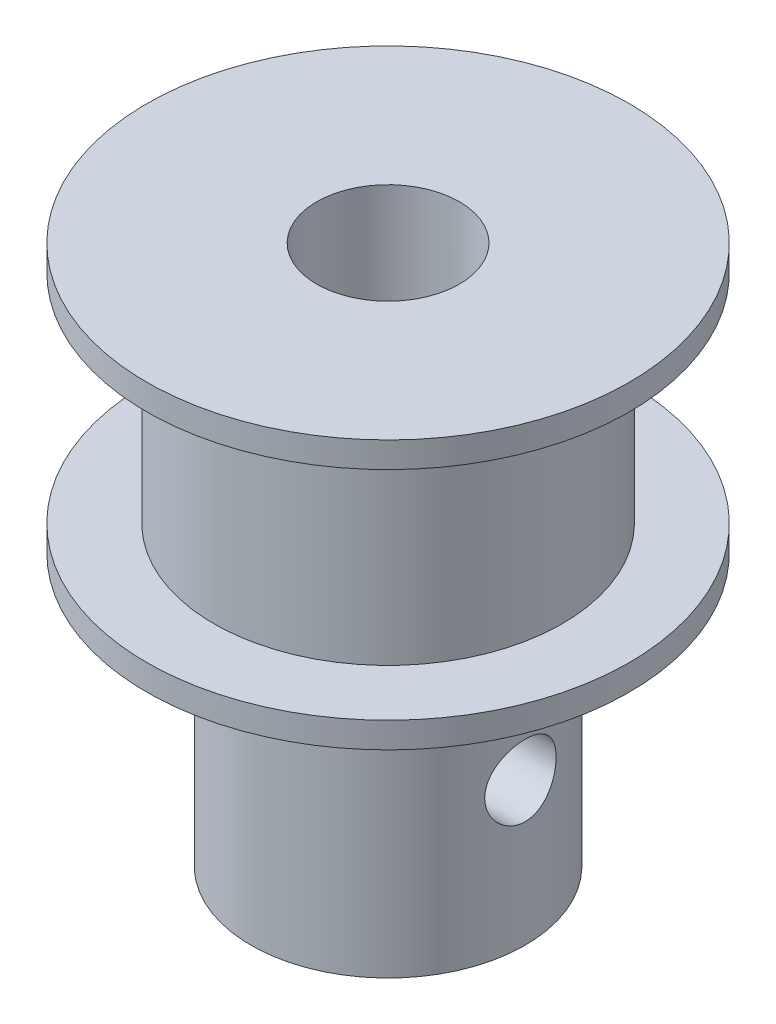
ISO-10303-21;
HEADER;
FILE_DESCRIPTION(('STEP AP214'),'2;1');
FILE_NAME('part.step','',(''),(''),'','','');
FILE_SCHEMA(('AUTOMOTIVE_DESIGN { 1 0 10303 214 1 1 1 1 }'));
ENDSEC;
DATA;
#1=APPLICATION_CONTEXT('core data for automotive mechanical design processes');
#2=APPLICATION_PROTOCOL_DEFINITION('international standard','automotive_design',2000,#1);
#3=PRODUCT_CONTEXT('',#1,'mechanical');
#4=PRODUCT('Part','Part','',(#3));
#5=PRODUCT_RELATED_PRODUCT_CATEGORY('part','',(#4));
#6=PRODUCT_DEFINITION_FORMATION('','',#4);
#7=PRODUCT_DEFINITION_CONTEXT('part definition',#1,'design');
#8=PRODUCT_DEFINITION('design','',#6,#7);
#9=PRODUCT_DEFINITION_SHAPE('','',#8);
#10=(LENGTH_UNIT() NAMED_UNIT(*) SI_UNIT(.MILLI.,.METRE.));
#11=(NAMED_UNIT(*) PLANE_ANGLE_UNIT() SI_UNIT($,.RADIAN.));
#12=(NAMED_UNIT(*) SI_UNIT($,.STERADIAN.) SOLID_ANGLE_UNIT());
#13=UNCERTAINTY_MEASURE_WITH_UNIT(LENGTH_MEASURE(1.E-05),#10,'distance_accuracy_value','');
#14=(GEOMETRIC_REPRESENTATION_CONTEXT(3) GLOBAL_UNCERTAINTY_ASSIGNED_CONTEXT((#13)) GLOBAL_UNIT_ASSIGNED_CONTEXT((#10,
#11,#12)) REPRESENTATION_CONTEXT('',''));
#15=CARTESIAN_POINT('',(0.,0.,0.));
#16=DIRECTION('',(0.,0.,1.));
#17=DIRECTION('',(1.,0.,0.));
#18=AXIS2_PLACEMENT_3D('',#15,#16,#17);
#19=CARTESIAN_POINT('',(0.,0.,0.));
#20=DIRECTION('',(0.,-1.,0.));
#21=DIRECTION('',(0.,0.,-1.));
#22=AXIS2_PLACEMENT_3D('',#19,#20,#21);
#23=CYLINDRICAL_SURFACE('',#22,2.5);
#24=CARTESIAN_POINT('',(2.16506350946109,5.,1.25000000000001));
#25=CARTESIAN_POINT('',(2.16506918410573,4.93486523975594,1.24999545384317));
#26=CARTESIAN_POINT('',(2.16804751484695,4.86964823559369,1.24487496341653));
#27=CARTESIAN_POINT('',(2.17952958065065,4.74121591915356,1.22465401237257));
#28=CARTESIAN_POINT('',(2.18804492569449,4.67800510619574,1.20953258069273));
#29=CARTESIAN_POINT('',(2.20936683256748,4.55568541957007,1.17012493587477));
#30=CARTESIAN_POINT('',(2.22215054341565,4.49655668440802,1.14588744061717));
#31=CARTESIAN_POINT('',(2.25053331021072,4.3832197475041,1.08908440672047));
#32=CARTESIAN_POINT('',(2.2661325184508,4.32901181217193,1.05651841754472));
#33=CARTESIAN_POINT('',(2.29996086321801,4.22211783930312,0.980833175663607));
#34=CARTESIAN_POINT('',(2.31830079547442,4.16992608040807,0.937065045179722));
#35=CARTESIAN_POINT('',(2.35464978482132,4.07323951449161,0.841567259518094));
#36=CARTESIAN_POINT('',(2.37265867289062,4.0287485467706,0.789833657227875));
#37=CARTESIAN_POINT('',(2.40776846191186,3.94579106106542,0.675611954268192));
#38=CARTESIAN_POINT('',(2.42472633022715,3.90793279017559,0.612633986265728));
#39=CARTESIAN_POINT('',(2.45438445124411,3.8435739334428,0.480196283249389));
#40=CARTESIAN_POINT('',(2.46708738979677,3.81706617982854,0.410740672672703));
#41=CARTESIAN_POINT('',(2.48600576555297,3.77811917337363,0.27255617990748));
#42=CARTESIAN_POINT('',(2.49261850276115,3.76481309205558,0.204127238111031));
#43=CARTESIAN_POINT('',(2.50009479807584,3.7497923516562,0.0657132858723191));
#44=CARTESIAN_POINT('',(2.50096183480737,3.74807067900536,-0.00427075730466423));
#45=CARTESIAN_POINT('',(2.49703727395563,3.75593334246294,-0.137290655529679));
#46=CARTESIAN_POINT('',(2.49273119865201,3.76454751940153,-0.20040149897098));
#47=CARTESIAN_POINT('',(2.47967806574684,3.79110105488082,-0.324142214897894));
#48=CARTESIAN_POINT('',(2.47093067582992,3.80904111122028,-0.384771901367398));
#49=CARTESIAN_POINT('',(2.44964479109568,3.85385320761227,-0.502886739461933));
#50=CARTESIAN_POINT('',(2.43705551911499,3.88084539146508,-0.560316779393964));
#51=CARTESIAN_POINT('',(2.40922057483359,3.94282927025187,-0.669971001891652));
#52=CARTESIAN_POINT('',(2.39397395196855,3.97782382912794,-0.722193311048298));
#53=CARTESIAN_POINT('',(2.36055492999037,4.05861918941627,-0.825217076122735));
#54=CARTESIAN_POINT('',(2.34224219997719,4.10512878540751,-0.875417593786692));
#55=CARTESIAN_POINT('',(2.30567925733515,4.20573715616272,-0.967630462872217));
#56=CARTESIAN_POINT('',(2.28742910332036,4.25984171534258,-1.00963651446778));
#57=CARTESIAN_POINT('',(2.25180195115606,4.37831024053011,-1.08688166830276));
#58=CARTESIAN_POINT('',(2.23455399988385,4.44310752881776,-1.12152164372256));
#59=CARTESIAN_POINT('',(2.2046931284822,4.57867208919875,-1.17914889125153));
#60=CARTESIAN_POINT('',(2.19207537557585,4.64943304127195,-1.2021483227636));
#61=CARTESIAN_POINT('',(2.17430794771293,4.78901813910349,-1.23397526378129));
#62=CARTESIAN_POINT('',(2.16864569810621,4.85755139880444,-1.24378140264996));
#63=CARTESIAN_POINT('',(2.16397399202012,4.99550167689568,-1.25189618326428));
#64=CARTESIAN_POINT('',(2.1649598361164,5.06491803639973,-1.25021294664377));
#65=CARTESIAN_POINT('',(2.17292920675731,5.19456739822341,-1.23629505417995));
#66=CARTESIAN_POINT('',(2.17924484383318,5.25497431388491,-1.22523477089058));
#67=CARTESIAN_POINT('',(2.19617526939177,5.3729597328387,-1.19462035579054));
#68=CARTESIAN_POINT('',(2.20679145006293,5.43053731343326,-1.17506347327951));
#69=CARTESIAN_POINT('',(2.23170277599571,5.54426416362837,-1.1270594857561));
#70=CARTESIAN_POINT('',(2.24614554053829,5.60022377106694,-1.0982425796159));
#71=CARTESIAN_POINT('',(2.27695149371562,5.70683658942374,-1.03285883001975));
#72=CARTESIAN_POINT('',(2.29331566693935,5.7574870543916,-0.996288005415263));
#73=CARTESIAN_POINT('',(2.3285999807042,5.85872345940444,-0.911046458998559));
#74=CARTESIAN_POINT('',(2.34758228942862,5.90849643839707,-0.8614315903937));
#75=CARTESIAN_POINT('',(2.38417793722366,5.99926529749199,-0.754255619247853));
#76=CARTESIAN_POINT('',(2.40179081259637,6.04025821278818,-0.696691843319175));
#77=CARTESIAN_POINT('',(2.43426702113696,6.11321715743763,-0.573169203198438));
#78=CARTESIAN_POINT('',(2.44904552090037,6.14491639776364,-0.507028871967633));
#79=CARTESIAN_POINT('',(2.47354193699126,6.19642237982174,-0.369402955801344));
#80=CARTESIAN_POINT('',(2.48326429595466,6.21623956420788,-0.297922126740211));
#81=CARTESIAN_POINT('',(2.49584385227353,6.24171070521833,-0.158724602913013));
#82=CARTESIAN_POINT('',(2.49924909885239,6.24849734484514,-0.0912643048130625));
#83=CARTESIAN_POINT('',(2.50052662968914,6.251054081818,0.0439074824390132));
#84=CARTESIAN_POINT('',(2.49840085083612,6.24682803565446,0.111618875368867));
#85=CARTESIAN_POINT('',(2.48917461047403,6.22822949150547,0.240672490396443));
#86=CARTESIAN_POINT('',(2.48241118334987,6.21454393842791,0.302140397264089));
#87=CARTESIAN_POINT('',(2.46490117079279,6.17834125087129,0.421807440229531));
#88=CARTESIAN_POINT('',(2.45415401415994,6.15582284988318,0.480006106194395));
#89=CARTESIAN_POINT('',(2.4290741343515,6.10159118479253,0.594279257806114));
#90=CARTESIAN_POINT('',(2.41460771498499,6.0695258459902,0.650156428375066));
#91=CARTESIAN_POINT('',(2.38360166427282,5.99755258642619,0.755968302267539));
#92=CARTESIAN_POINT('',(2.3670610819795,5.95764106360541,0.805900259268642));
#93=CARTESIAN_POINT('',(2.33160762783284,5.86650357622162,0.903642505196122));
#94=CARTESIAN_POINT('',(2.31262248764622,5.81454689065351,0.950747105674098));
#95=CARTESIAN_POINT('',(2.27578845203565,5.70318659858779,1.03582910924335));
#96=CARTESIAN_POINT('',(2.25794057202331,5.64377647391539,1.07379843751258));
#97=CARTESIAN_POINT('',(2.22499506631145,5.51670419177381,1.14053884973208));
#98=CARTESIAN_POINT('',(2.21000217820337,5.44884058608908,1.16898133245118));
#99=CARTESIAN_POINT('',(2.18582695410439,5.30833449457528,1.21359838688302));
#100=CARTESIAN_POINT('',(2.17662520184627,5.23570888885914,1.22981398896919));
#101=CARTESIAN_POINT('',(2.16911590752238,5.135243305435,1.24295875983053));
#102=CARTESIAN_POINT('',(2.16760161256439,5.10829013200265,1.24559513120482));
#103=CARTESIAN_POINT('',(2.16557419859687,5.0542293991472,1.24911675636246));
#104=CARTESIAN_POINT('',(2.16506114656386,5.02712182951766,1.25000189299985));
#105=CARTESIAN_POINT('',(2.16506350946109,5.,1.25000000000001));
#106=B_SPLINE_CURVE_WITH_KNOTS('',3,(#24,#25,#26,#27,#28,#29,#30,#31,#32,#33,#34,#35,#36,#37,
#38,#39,#40,#41,#42,#43,#44,#45,#46,#47,#48,#49,#50,#51,#52,#53,#54,#55,#56,#57,#58,#59,#60,#61,
#62,#63,#64,#65,#66,#67,#68,#69,#70,#71,#72,#73,#74,#75,#76,#77,#78,#79,#80,#81,#82,#83,#84,#85,
#86,#87,#88,#89,#90,#91,#92,#93,#94,#95,#96,#97,#98,#99,#100,#101,#102,#103,#104,#105),
.UNSPECIFIED.,.T.,.F.,(4,2,2,2,2,2,2,2,2,2,2,2,2,2,2,2,2,2,2,2,2,2,2,2,2,2,2,2,2,2,2,2,2,2,2,2,
2,2,2,2,4),(0.,0.195290153243395,0.390991116031006,0.585660744898608,0.780340906806437,
0.991077890622792,1.20191963855464,1.42697365298454,1.65188533704864,1.86079356209919,
2.0695752960755,2.26020121855673,2.45084140646819,2.64411918413933,2.8374662418784,
3.04908989321113,3.26087560307398,3.48611052161811,3.71110967764631,3.91827863567765,
4.12530116485466,4.30967729280032,4.49411315545079,4.6870912050761,4.88016857775059,
5.09758429475767,5.31507331222753,5.53830226766207,5.76133474760965,5.96390337986859,
6.16640108492465,6.35555531089366,6.54473666890016,6.7420093839934,6.93937287625899,
7.15637802312585,7.37357428556443,7.59763436298257,7.82093916253451,7.90225168981637,
7.98356965618176),.UNSPECIFIED.);
#107=CARTESIAN_POINT('',(2.16506350946109,5.,1.25000000000001));
#108=VERTEX_POINT('',#107);
#109=EDGE_CURVE('E103',#108,#108,#106,.T.);
#110=ORIENTED_EDGE('',*,*,#109,.T.);
#111=EDGE_LOOP('',(#110));
#112=FACE_BOUND('',#111,.T.);
#113=CARTESIAN_POINT('',(1.25,5.,-2.1650635094611));
#114=CARTESIAN_POINT('',(1.24999545384316,4.93486523975594,-2.16506918410574));
#115=CARTESIAN_POINT('',(1.24487496341652,4.86964823559369,-2.16804751484696));
#116=CARTESIAN_POINT('',(1.22465401237257,4.74121591915356,-2.17952958065065));
#117=CARTESIAN_POINT('',(1.20953258069272,4.67800510619574,-2.18804492569449));
#118=CARTESIAN_POINT('',(1.17012493587477,4.55568541957007,-2.20936683256748));
#119=CARTESIAN_POINT('',(1.14588744061716,4.49655668440802,-2.22215054341565));
#120=CARTESIAN_POINT('',(1.08908440672047,4.3832197475041,-2.25053331021072));
#121=CARTESIAN_POINT('',(1.05651841754472,4.32901181217193,-2.26613251845081));
#122=CARTESIAN_POINT('',(0.980833175663598,4.22211783930312,-2.29996086321802));
#123=CARTESIAN_POINT('',(0.937065045179713,4.16992608040807,-2.31830079547442));
#124=CARTESIAN_POINT('',(0.841567259518085,4.07323951449161,-2.35464978482132));
#125=CARTESIAN_POINT('',(0.789833657227866,4.0287485467706,-2.37265867289062));
#126=CARTESIAN_POINT('',(0.675611954268182,3.94579106106542,-2.40776846191186));
#127=CARTESIAN_POINT('',(0.612633986265718,3.90793279017559,-2.42472633022716));
#128=CARTESIAN_POINT('',(0.48019628324938,3.8435739334428,-2.45438445124411));
#129=CARTESIAN_POINT('',(0.410740672672694,3.81706617982854,-2.46708738979677));
#130=CARTESIAN_POINT('',(0.272556179907472,3.77811917337363,-2.48600576555297));
#131=CARTESIAN_POINT('',(0.204127238111022,3.76481309205558,-2.49261850276115));
#132=CARTESIAN_POINT('',(0.0657132858723103,3.7497923516562,-2.50009479807584));
#133=CARTESIAN_POINT('',(-0.00427075730467304,3.74807067900536,-2.50096183480737));
#134=CARTESIAN_POINT('',(-0.137290655529687,3.75593334246294,-2.49703727395563));
#135=CARTESIAN_POINT('',(-0.200401498970989,3.76454751940153,-2.492731198652));
#136=CARTESIAN_POINT('',(-0.324142214897902,3.79110105488082,-2.47967806574684));
#137=CARTESIAN_POINT('',(-0.384771901367407,3.80904111122028,-2.47093067582992));
#138=CARTESIAN_POINT('',(-0.502886739461942,3.85385320761227,-2.44964479109568));
#139=CARTESIAN_POINT('',(-0.560316779393973,3.88084539146508,-2.43705551911499));
#140=CARTESIAN_POINT('',(-0.669971001891661,3.94282927025187,-2.40922057483359));
#141=CARTESIAN_POINT('',(-0.722193311048307,3.97782382912794,-2.39397395196855));
#142=CARTESIAN_POINT('',(-0.825217076122744,4.05861918941627,-2.36055492999036));
#143=CARTESIAN_POINT('',(-0.875417593786701,4.10512878540751,-2.34224219997719));
#144=CARTESIAN_POINT('',(-0.967630462872225,4.20573715616272,-2.30567925733515));
#145=CARTESIAN_POINT('',(-1.00963651446779,4.25984171534258,-2.28742910332036));
#146=CARTESIAN_POINT('',(-1.08688166830276,4.37831024053011,-2.25180195115606));
#147=CARTESIAN_POINT('',(-1.12152164372256,4.44310752881776,-2.23455399988384));
#148=CARTESIAN_POINT('',(-1.17914889125154,4.57867208919875,-2.2046931284822));
#149=CARTESIAN_POINT('',(-1.20214832276361,4.64943304127195,-2.19207537557584));
#150=CARTESIAN_POINT('',(-1.2339752637813,4.78901813910349,-2.17430794771293));
#151=CARTESIAN_POINT('',(-1.24378140264997,4.85755139880444,-2.1686456981062));
#152=CARTESIAN_POINT('',(-1.25189618326428,4.99550167689568,-2.16397399202012));
#153=CARTESIAN_POINT('',(-1.25021294664378,5.06491803639973,-2.16495983611639));
#154=CARTESIAN_POINT('',(-1.23629505417996,5.19456739822341,-2.17292920675731));
#155=CARTESIAN_POINT('',(-1.22523477089058,5.25497431388491,-2.17924484383318));
#156=CARTESIAN_POINT('',(-1.19462035579055,5.3729597328387,-2.19617526939176));
#157=CARTESIAN_POINT('',(-1.17506347327952,5.43053731343326,-2.20679145006292));
#158=CARTESIAN_POINT('',(-1.12705948575611,5.54426416362837,-2.23170277599571));
#159=CARTESIAN_POINT('',(-1.0982425796159,5.60022377106694,-2.24614554053829));
#160=CARTESIAN_POINT('',(-1.03285883001976,5.70683658942374,-2.27695149371562));
#161=CARTESIAN_POINT('',(-0.996288005415271,5.7574870543916,-2.29331566693934));
#162=CARTESIAN_POINT('',(-0.911046458998567,5.85872345940444,-2.3285999807042));
#163=CARTESIAN_POINT('',(-0.861431590393709,5.90849643839707,-2.34758228942861));
#164=CARTESIAN_POINT('',(-0.754255619247861,5.99926529749199,-2.38417793722366));
#165=CARTESIAN_POINT('',(-0.696691843319184,6.04025821278818,-2.40179081259637));
#166=CARTESIAN_POINT('',(-0.573169203198446,6.11321715743763,-2.43426702113696));
#167=CARTESIAN_POINT('',(-0.507028871967641,6.14491639776364,-2.44904552090037));
#168=CARTESIAN_POINT('',(-0.369402955801352,6.19642237982174,-2.47354193699126));
#169=CARTESIAN_POINT('',(-0.29792212674022,6.21623956420788,-2.48326429595466));
#170=CARTESIAN_POINT('',(-0.158724602913021,6.24171070521833,-2.49584385227353));
#171=CARTESIAN_POINT('',(-0.0912643048130714,6.24849734484514,-2.49924909885239));
#172=CARTESIAN_POINT('',(0.0439074824390044,6.251054081818,-2.50052662968914));
#173=CARTESIAN_POINT('',(0.111618875368858,6.24682803565446,-2.49840085083612));
#174=CARTESIAN_POINT('',(0.240672490396434,6.22822949150547,-2.48917461047403));
#175=CARTESIAN_POINT('',(0.30214039726408,6.21454393842791,-2.48241118334987));
#176=CARTESIAN_POINT('',(0.421807440229522,6.17834125087129,-2.46490117079279));
#177=CARTESIAN_POINT('',(0.480006106194386,6.15582284988318,-2.45415401415995));
#178=CARTESIAN_POINT('',(0.594279257806106,6.10159118479253,-2.4290741343515));
#179=CARTESIAN_POINT('',(0.650156428375059,6.0695258459902,-2.41460771498499));
#180=CARTESIAN_POINT('',(0.755968302267532,5.99755258642619,-2.38360166427283));
#181=CARTESIAN_POINT('',(0.805900259268634,5.95764106360541,-2.36706108197951));
#182=CARTESIAN_POINT('',(0.903642505196114,5.86650357622162,-2.33160762783285));
#183=CARTESIAN_POINT('',(0.95074710567409,5.81454689065351,-2.31262248764622));
#184=CARTESIAN_POINT('',(1.03582910924334,5.70318659858779,-2.27578845203565));
#185=CARTESIAN_POINT('',(1.07379843751257,5.6437764739154,-2.25794057202332));
#186=CARTESIAN_POINT('',(1.14053884973207,5.51670419177381,-2.22499506631145));
#187=CARTESIAN_POINT('',(1.16898133245117,5.44884058608908,-2.21000217820338));
#188=CARTESIAN_POINT('',(1.21359838688301,5.30833449457528,-2.18582695410439));
#189=CARTESIAN_POINT('',(1.22981398896918,5.23570888885914,-2.17662520184627));
#190=CARTESIAN_POINT('',(1.24295875983052,5.135243305435,-2.16911590752238));
#191=CARTESIAN_POINT('',(1.24559513120481,5.10829013200265,-2.1676016125644));
#192=CARTESIAN_POINT('',(1.24911675636245,5.0542293991472,-2.16557419859688));
#193=CARTESIAN_POINT('',(1.25000189299984,5.02712182951766,-2.16506114656387));
#194=CARTESIAN_POINT('',(1.25,5.,-2.1650635094611));
#195=B_SPLINE_CURVE_WITH_KNOTS('',3,(#113,#114,#115,#116,#117,#118,#119,#120,#121,#122,#123,
#124,#125,#126,#127,#128,#129,#130,#131,#132,#133,#134,#135,#136,#137,#138,#139,#140,#141,#142,
#143,#144,#145,#146,#147,#148,#149,#150,#151,#152,#153,#154,#155,#156,#157,#158,#159,#160,#161,
#162,#163,#164,#165,#166,#167,#168,#169,#170,#171,#172,#173,#174,#175,#176,#177,#178,#179,#180,
#181,#182,#183,#184,#185,#186,#187,#188,#189,#190,#191,#192,#193,#194),.UNSPECIFIED.,.T.,.F.,(4,
2,2,2,2,2,2,2,2,2,2,2,2,2,2,2,2,2,2,2,2,2,2,2,2,2,2,2,2,2,2,2,2,2,2,2,2,2,2,2,4),(0.,
0.195290153243395,0.390991116031006,0.585660744898607,0.780340906806438,0.991077890622794,
1.20191963855464,1.42697365298454,1.65188533704864,1.86079356209919,2.0695752960755,
2.26020121855673,2.45084140646819,2.64411918413933,2.8374662418784,3.04908989321113,
3.26087560307398,3.48611052161811,3.71110967764631,3.91827863567765,4.12530116485466,
4.30967729280032,4.49411315545079,4.6870912050761,4.88016857775059,5.09758429475767,
5.31507331222753,5.53830226766207,5.76133474760965,5.96390337986859,6.16640108492465,
6.35555531089366,6.54473666890016,6.7420093839934,6.93937287625899,7.15637802312585,
7.37357428556443,7.59763436298256,7.82093916253451,7.90225168981637,7.98356965618176),.UNSPECIFIED.);
#196=CARTESIAN_POINT('',(1.25,5.,-2.1650635094611));
#197=VERTEX_POINT('',#196);
#198=EDGE_CURVE('E73',#197,#197,#195,.T.);
#199=ORIENTED_EDGE('',*,*,#198,.T.);
#200=EDGE_LOOP('',(#199));
#201=FACE_BOUND('',#200,.T.);
#202=CARTESIAN_POINT('',(0.,0.,0.));
#203=DIRECTION('',(0.,-1.,0.));
#204=DIRECTION('',(0.,0.,-1.));
#205=AXIS2_PLACEMENT_3D('',#202,#203,#204);
#206=CIRCLE('',#205,2.5);
#207=CARTESIAN_POINT('',(0.,0.,-2.5));
#208=VERTEX_POINT('',#207);
#209=EDGE_CURVE('E70',#208,#208,#206,.T.);
#210=ORIENTED_EDGE('',*,*,#209,.T.);
#211=EDGE_LOOP('',(#210));
#212=FACE_BOUND('',#211,.T.);
#213=CARTESIAN_POINT('',(0.,18.9,0.));
#214=DIRECTION('',(0.,-1.,0.));
#215=DIRECTION('',(0.,0.,-1.));
#216=AXIS2_PLACEMENT_3D('',#213,#214,#215);
#217=CIRCLE('',#216,2.5);
#218=CARTESIAN_POINT('',(0.,18.9,-2.5));
#219=VERTEX_POINT('',#218);
#220=EDGE_CURVE('E10',#219,#219,#217,.T.);
#221=ORIENTED_EDGE('',*,*,#220,.F.);
#222=EDGE_LOOP('',(#221));
#223=FACE_BOUND('',#222,.T.);
#224=ADVANCED_FACE('F36',(#112,#201,#212,#223),#23,.F.);
#225=CARTESIAN_POINT('',(2.5,18.9,0.));
#226=DIRECTION('',(0.,1.,0.));
#227=DIRECTION('',(0.,0.,1.));
#228=AXIS2_PLACEMENT_3D('',#225,#226,#227);
#229=PLANE('',#228);
#230=ORIENTED_EDGE('',*,*,#220,.T.);
#231=EDGE_LOOP('',(#230));
#232=FACE_BOUND('',#231,.T.);
#233=CARTESIAN_POINT('',(0.,18.9,0.));
#234=DIRECTION('',(0.,-1.,0.));
#235=DIRECTION('',(0.,0.,-1.));
#236=AXIS2_PLACEMENT_3D('',#233,#234,#235);
#237=CIRCLE('',#236,8.45);
#238=CARTESIAN_POINT('',(0.,18.9,-8.45));
#239=VERTEX_POINT('',#238);
#240=EDGE_CURVE('E42',#239,#239,#237,.T.);
#241=ORIENTED_EDGE('',*,*,#240,.F.);
#242=EDGE_LOOP('',(#241));
#243=FACE_BOUND('',#242,.T.);
#244=ADVANCED_FACE('F132',(#232,#243),#229,.T.);
#245=CARTESIAN_POINT('',(0.,0.,0.));
#246=DIRECTION('',(0.,-1.,0.));
#247=DIRECTION('',(0.,0.,-1.));
#248=AXIS2_PLACEMENT_3D('',#245,#246,#247);
#249=CYLINDRICAL_SURFACE('',#248,8.45);
#250=ORIENTED_EDGE('',*,*,#240,.T.);
#251=EDGE_LOOP('',(#250));
#252=FACE_BOUND('',#251,.T.);
#253=CARTESIAN_POINT('',(0.,18.,0.));
#254=DIRECTION('',(0.,-1.,0.));
#255=DIRECTION('',(0.,0.,-1.));
#256=AXIS2_PLACEMENT_3D('',#253,#254,#255);
#257=CIRCLE('',#256,8.45);
#258=CARTESIAN_POINT('',(0.,18.,-8.45));
#259=VERTEX_POINT('',#258);
#260=EDGE_CURVE('E46',#259,#259,#257,.T.);
#261=ORIENTED_EDGE('',*,*,#260,.F.);
#262=EDGE_LOOP('',(#261));
#263=FACE_BOUND('',#262,.T.);
#264=ADVANCED_FACE('F136',(#252,#263),#249,.T.);
#265=CARTESIAN_POINT('',(8.45,18.,0.));
#266=DIRECTION('',(0.,-1.,0.));
#267=DIRECTION('',(0.,0.,-1.));
#268=AXIS2_PLACEMENT_3D('',#265,#266,#267);
#269=PLANE('',#268);
#270=ORIENTED_EDGE('',*,*,#260,.T.);
#271=EDGE_LOOP('',(#270));
#272=FACE_BOUND('',#271,.T.);
#273=CARTESIAN_POINT('',(0.,18.,0.));
#274=DIRECTION('',(0.,-1.,0.));
#275=DIRECTION('',(0.,0.,-1.));
#276=AXIS2_PLACEMENT_3D('',#273,#274,#275);
#277=CIRCLE('',#276,6.1);
#278=CARTESIAN_POINT('',(0.,18.,-6.1));
#279=VERTEX_POINT('',#278);
#280=EDGE_CURVE('E50',#279,#279,#277,.T.);
#281=ORIENTED_EDGE('',*,*,#280,.F.);
#282=EDGE_LOOP('',(#281));
#283=FACE_BOUND('',#282,.T.);
#284=ADVANCED_FACE('F178',(#272,#283),#269,.T.);
#285=CARTESIAN_POINT('',(0.,0.,0.));
#286=DIRECTION('',(0.,-1.,0.));
#287=DIRECTION('',(0.,0.,-1.));
#288=AXIS2_PLACEMENT_3D('',#285,#286,#287);
#289=CYLINDRICAL_SURFACE('',#288,6.1);
#290=ORIENTED_EDGE('',*,*,#280,.T.);
#291=EDGE_LOOP('',(#290));
#292=FACE_BOUND('',#291,.T.);
#293=CARTESIAN_POINT('',(0.,10.4,0.));
#294=DIRECTION('',(0.,-1.,0.));
#295=DIRECTION('',(0.,0.,-1.));
#296=AXIS2_PLACEMENT_3D('',#293,#294,#295);
#297=CIRCLE('',#296,6.1);
#298=CARTESIAN_POINT('',(0.,10.4,-6.1));
#299=VERTEX_POINT('',#298);
#300=EDGE_CURVE('E55',#299,#299,#297,.T.);
#301=ORIENTED_EDGE('',*,*,#300,.F.);
#302=EDGE_LOOP('',(#301));
#303=FACE_BOUND('',#302,.T.);
#304=ADVANCED_FACE('F186',(#292,#303),#289,.T.);
#305=CARTESIAN_POINT('',(6.1,10.4,0.));
#306=DIRECTION('',(0.,1.,0.));
#307=DIRECTION('',(0.,0.,1.));
#308=AXIS2_PLACEMENT_3D('',#305,#306,#307);
#309=PLANE('',#308);
#310=ORIENTED_EDGE('',*,*,#300,.T.);
#311=EDGE_LOOP('',(#310));
#312=FACE_BOUND('',#311,.T.);
#313=CARTESIAN_POINT('',(0.,10.4,0.));
#314=DIRECTION('',(0.,-1.,0.));
#315=DIRECTION('',(0.,0.,-1.));
#316=AXIS2_PLACEMENT_3D('',#313,#314,#315);
#317=CIRCLE('',#316,8.45);
#318=CARTESIAN_POINT('',(0.,10.4,-8.45));
#319=VERTEX_POINT('',#318);
#320=EDGE_CURVE('E58',#319,#319,#317,.T.);
#321=ORIENTED_EDGE('',*,*,#320,.F.);
#322=EDGE_LOOP('',(#321));
#323=FACE_BOUND('',#322,.T.);
#324=ADVANCED_FACE('F195',(#312,#323),#309,.T.);
#325=CARTESIAN_POINT('',(0.,0.,0.));
#326=DIRECTION('',(0.,-1.,0.));
#327=DIRECTION('',(0.,0.,-1.));
#328=AXIS2_PLACEMENT_3D('',#325,#326,#327);
#329=CYLINDRICAL_SURFACE('',#328,8.45);
#330=ORIENTED_EDGE('',*,*,#320,.T.);
#331=EDGE_LOOP('',(#330));
#332=FACE_BOUND('',#331,.T.);
#333=CARTESIAN_POINT('',(0.,9.5,0.));
#334=DIRECTION('',(0.,-1.,0.));
#335=DIRECTION('',(0.,0.,-1.));
#336=AXIS2_PLACEMENT_3D('',#333,#334,#335);
#337=CIRCLE('',#336,8.45);
#338=CARTESIAN_POINT('',(0.,9.5,-8.45));
#339=VERTEX_POINT('',#338);
#340=EDGE_CURVE('E61',#339,#339,#337,.T.);
#341=ORIENTED_EDGE('',*,*,#340,.F.);
#342=EDGE_LOOP('',(#341));
#343=FACE_BOUND('',#342,.T.);
#344=ADVANCED_FACE('F204',(#332,#343),#329,.T.);
#345=CARTESIAN_POINT('',(8.45,9.5,0.));
#346=DIRECTION('',(0.,-1.,0.));
#347=DIRECTION('',(0.,0.,-1.));
#348=AXIS2_PLACEMENT_3D('',#345,#346,#347);
#349=PLANE('',#348);
#350=ORIENTED_EDGE('',*,*,#340,.T.);
#351=EDGE_LOOP('',(#350));
#352=FACE_BOUND('',#351,.T.);
#353=CARTESIAN_POINT('',(0.,9.5,0.));
#354=DIRECTION('',(0.,-1.,0.));
#355=DIRECTION('',(0.,0.,-1.));
#356=AXIS2_PLACEMENT_3D('',#353,#354,#355);
#357=CIRCLE('',#356,4.8);
#358=CARTESIAN_POINT('',(0.,9.5,-4.8));
#359=VERTEX_POINT('',#358);
#360=EDGE_CURVE('E64',#359,#359,#357,.T.);
#361=ORIENTED_EDGE('',*,*,#360,.F.);
#362=EDGE_LOOP('',(#361));
#363=FACE_BOUND('',#362,.T.);
#364=ADVANCED_FACE('F118',(#352,#363),#349,.T.);
#365=CARTESIAN_POINT('',(0.,0.,0.));
#366=DIRECTION('',(0.,-1.,0.));
#367=DIRECTION('',(0.,0.,-1.));
#368=AXIS2_PLACEMENT_3D('',#365,#366,#367);
#369=CYLINDRICAL_SURFACE('',#368,4.8);
#370=CARTESIAN_POINT('',(4.63438237524699,5.,1.25000000000002));
#371=CARTESIAN_POINT('',(4.6343836230447,5.06892329669401,1.24999821988538));
#372=CARTESIAN_POINT('',(4.63593673484143,5.13786575105377,1.24428007498691));
#373=CARTESIAN_POINT('',(4.64196383367195,5.2737638992749,1.22159928860987));
#374=CARTESIAN_POINT('',(4.64643937507339,5.34071851603105,1.20463066320656));
#375=CARTESIAN_POINT('',(4.65777084535931,5.47065551742375,1.16004102349852));
#376=CARTESIAN_POINT('',(4.66462353111698,5.53364317653101,1.13243451674681));
#377=CARTESIAN_POINT('',(4.67993306797215,5.65410175975817,1.06739774198767));
#378=CARTESIAN_POINT('',(4.68839002232525,5.71157232842262,1.02996684159297));
#379=CARTESIAN_POINT('',(4.70618125477147,5.82073670976053,0.945389116401701));
#380=CARTESIAN_POINT('',(4.71553050766286,5.87227940980279,0.898050361173205));
#381=CARTESIAN_POINT('',(4.73392341360254,5.96679084720441,0.795413718727526));
#382=CARTESIAN_POINT('',(4.74296703610858,6.00975872975709,0.740115038946028));
#383=CARTESIAN_POINT('',(4.75989626994351,6.08652642759709,0.622085249281754));
#384=CARTESIAN_POINT('',(4.76776215325651,6.12017669192747,0.559253794995509));
#385=CARTESIAN_POINT('',(4.78127819076159,6.1763797495974,0.428586531974634));
#386=CARTESIAN_POINT('',(4.78692870061573,6.19893432441731,0.360751528602704));
#387=CARTESIAN_POINT('',(4.79527145510372,6.23181862167729,0.223579332420512));
#388=CARTESIAN_POINT('',(4.79802577108713,6.24240523184301,0.154307564284899));
#389=CARTESIAN_POINT('',(4.80048254999011,6.25186058985094,0.0149201262795548));
#390=CARTESIAN_POINT('',(4.80018550093225,6.25073121149915,-0.0551954068502785));
#391=CARTESIAN_POINT('',(4.79661877620077,6.23696902739642,-0.192494450864603));
#392=CARTESIAN_POINT('',(4.7934207986247,6.22461366624537,-0.259707916769945));
#393=CARTESIAN_POINT('',(4.78449571870045,6.18919759649189,-0.391072528534071));
#394=CARTESIAN_POINT('',(4.77876847561785,6.16613629218135,-0.455223503768369));
#395=CARTESIAN_POINT('',(4.76532076295285,6.10974582313906,-0.579359038425679));
#396=CARTESIAN_POINT('',(4.75758168374491,6.07632019937085,-0.639297681011932));
#397=CARTESIAN_POINT('',(4.7409463199871,6.0002236204877,-0.752810707336345));
#398=CARTESIAN_POINT('',(4.7320498191391,5.95755093629408,-0.806383897914021));
#399=CARTESIAN_POINT('',(4.71375808932219,5.86269316360162,-0.90730083797091));
#400=CARTESIAN_POINT('',(4.7043558854743,5.81026590379419,-0.95441594991903));
#401=CARTESIAN_POINT('',(4.68634900668884,5.69815657347504,-1.03923939393577));
#402=CARTESIAN_POINT('',(4.67774437586129,5.63847410213291,-1.07694720592546));
#403=CARTESIAN_POINT('',(4.66228002426164,5.51307087784483,-1.14204903127301));
#404=CARTESIAN_POINT('',(4.65543042632832,5.44731794464337,-1.1693836296494));
#405=CARTESIAN_POINT('',(4.64437890764098,5.3119274943202,-1.21253710049592));
#406=CARTESIAN_POINT('',(4.64017636509217,5.24229089366091,-1.22835867751694));
#407=CARTESIAN_POINT('',(4.63502651235057,5.10324128074045,-1.24764851530656));
#408=CARTESIAN_POINT('',(4.63398965884467,5.03387868574766,-1.251456688304));
#409=CARTESIAN_POINT('',(4.63504406766128,4.8955082926454,-1.24754587299363));
#410=CARTESIAN_POINT('',(4.63713501446779,4.82650045945403,-1.23982804736794));
#411=CARTESIAN_POINT('',(4.64412319558908,4.69208989616975,-1.21338336929957));
#412=CARTESIAN_POINT('',(4.64896893270299,4.62664451430902,-1.19485838067904));
#413=CARTESIAN_POINT('',(4.66087093300724,4.49978904822121,-1.14755099423974));
#414=CARTESIAN_POINT('',(4.66792747482007,4.43837947379819,-1.11876730347801));
#415=CARTESIAN_POINT('',(4.68364158621267,4.31990976857935,-1.05106136088973));
#416=CARTESIAN_POINT('',(4.6923297783458,4.262968658071,-1.0119381199671));
#417=CARTESIAN_POINT('',(4.71025503796611,4.15633490393827,-0.924914680709662));
#418=CARTESIAN_POINT('',(4.71949220346977,4.10664356022858,-0.877012911811993));
#419=CARTESIAN_POINT('',(4.73778105166574,4.01452192305853,-0.772224591989678));
#420=CARTESIAN_POINT('',(4.74682071300448,3.97232794970596,-0.715127781879479));
#421=CARTESIAN_POINT('',(4.76343538104161,3.89812492170705,-0.59446338609987));
#422=CARTESIAN_POINT('',(4.77101046537628,3.86611532713528,-0.530896143696706));
#423=CARTESIAN_POINT('',(4.78379391764337,3.81347807329326,-0.399541126901111));
#424=CARTESIAN_POINT('',(4.78901970054155,3.79276641122214,-0.331788790552373));
#425=CARTESIAN_POINT('',(4.79659224683095,3.76306575418175,-0.193609722321034));
#426=CARTESIAN_POINT('',(4.79893961654396,3.75407429039251,-0.123183556889133));
#427=CARTESIAN_POINT('',(4.80046369951757,3.74821794014517,0.0161316069055542));
#428=CARTESIAN_POINT('',(4.79973125765023,3.75100561767224,0.0850052183898524));
#429=CARTESIAN_POINT('',(4.79538193333574,3.76782587782802,0.221267294742806));
#430=CARTESIAN_POINT('',(4.79176515036553,3.78185807264892,0.288655810747992));
#431=CARTESIAN_POINT('',(4.78207006290564,3.82057634063122,0.419637508316099));
#432=CARTESIAN_POINT('',(4.77600738750733,3.84519483265327,0.483251899924623));
#433=CARTESIAN_POINT('',(4.76205611532069,3.90432624448669,0.605483429808974));
#434=CARTESIAN_POINT('',(4.75416727194813,3.93884050065601,0.664099891759245));
#435=CARTESIAN_POINT('',(4.7371576239572,4.01781688112139,0.776300733904961));
#436=CARTESIAN_POINT('',(4.72801041223226,4.06251143629401,0.829717499939046));
#437=CARTESIAN_POINT('',(4.70962626689217,4.16013488905475,0.928410457799513));
#438=CARTESIAN_POINT('',(4.70038931062817,4.21306591870498,0.973684535280702));
#439=CARTESIAN_POINT('',(4.68265231898928,4.32697813837307,1.05573180937616));
#440=CARTESIAN_POINT('',(4.67417149236579,4.38810326821163,1.0923096702867));
#441=CARTESIAN_POINT('',(4.6591731228688,4.51584851189726,1.15461674329033));
#442=CARTESIAN_POINT('',(4.65265424084935,4.58246483792676,1.18035336000573));
#443=CARTESIAN_POINT('',(4.64326677276183,4.70740519655561,1.21670031206481));
#444=CARTESIAN_POINT('',(4.63996134757394,4.76516535065731,1.22915919273297));
#445=CARTESIAN_POINT('',(4.63551872537194,4.88194573803172,1.2458093760421));
#446=CARTESIAN_POINT('',(4.63438130648373,4.94096584173579,1.25000152470319));
#447=CARTESIAN_POINT('',(4.63438237524699,5.,1.25000000000002));
#448=B_SPLINE_CURVE_WITH_KNOTS('',3,(#370,#371,#372,#373,#374,#375,#376,#377,#378,#379,#380,
#381,#382,#383,#384,#385,#386,#387,#388,#389,#390,#391,#392,#393,#394,#395,#396,#397,#398,#399,
#400,#401,#402,#403,#404,#405,#406,#407,#408,#409,#410,#411,#412,#413,#414,#415,#416,#417,#418,
#419,#420,#421,#422,#423,#424,#425,#426,#427,#428,#429,#430,#431,#432,#433,#434,#435,#436,#437,
#438,#439,#440,#441,#442,#443,#444,#445,#446,#447),.UNSPECIFIED.,.T.,.F.,(4,2,2,2,2,2,2,2,2,2,2,
2,2,2,2,2,2,2,2,2,2,2,2,2,2,2,2,2,2,2,2,2,2,2,2,2,2,2,4),(0.,0.206552923581623,0.41321579711143,
0.619597823185702,0.8259931371428,1.03683462120511,1.2476971131519,1.46177013046431,
1.67580876582647,1.88516031968145,2.09447839124446,2.2987599375307,2.50305285196666,
2.70930724674109,2.91560024170517,3.12794032645032,3.34029214773477,3.55384253667136,
3.76734274377572,3.97474525892321,4.1821268538089,4.38575351910909,4.58940585732754,
4.79735252705866,5.00533643682838,5.2190203776082,5.43269298803344,5.64475445197899,
5.85677123867481,6.06257874131569,6.26837914624634,6.47288481820734,6.67741812033407,
6.88719709548871,7.09703046383387,7.31120673531451,7.52523648524117,7.70217123246313,
7.87908787118383),.UNSPECIFIED.);
#449=CARTESIAN_POINT('',(4.63438237524699,5.,1.25000000000002));
#450=VERTEX_POINT('',#449);
#451=EDGE_CURVE('E100',#450,#450,#448,.T.);
#452=ORIENTED_EDGE('',*,*,#451,.T.);
#453=EDGE_LOOP('',(#452));
#454=FACE_BOUND('',#453,.T.);
#455=CARTESIAN_POINT('',(1.25,5.,-4.634382375247));
#456=CARTESIAN_POINT('',(1.24999821988536,5.06892329669401,-4.6343836230447));
#457=CARTESIAN_POINT('',(1.2442800749869,5.13786575105377,-4.63593673484144));
#458=CARTESIAN_POINT('',(1.22159928860985,5.2737638992749,-4.64196383367196));
#459=CARTESIAN_POINT('',(1.20463066320654,5.34071851603105,-4.64643937507339));
#460=CARTESIAN_POINT('',(1.16004102349851,5.47065551742375,-4.65777084535932));
#461=CARTESIAN_POINT('',(1.13243451674679,5.53364317653101,-4.66462353111698));
#462=CARTESIAN_POINT('',(1.06739774198766,5.65410175975817,-4.67993306797215));
#463=CARTESIAN_POINT('',(1.02996684159295,5.71157232842262,-4.68839002232526));
#464=CARTESIAN_POINT('',(0.945389116401684,5.82073670976053,-4.70618125477147));
#465=CARTESIAN_POINT('',(0.898050361173188,5.87227940980279,-4.71553050766286));
#466=CARTESIAN_POINT('',(0.795413718727509,5.96679084720441,-4.73392341360255));
#467=CARTESIAN_POINT('',(0.740115038946011,6.00975872975709,-4.74296703610858));
#468=CARTESIAN_POINT('',(0.622085249281738,6.08652642759709,-4.75989626994351));
#469=CARTESIAN_POINT('',(0.559253794995492,6.12017669192747,-4.76776215325651));
#470=CARTESIAN_POINT('',(0.428586531974617,6.1763797495974,-4.78127819076159));
#471=CARTESIAN_POINT('',(0.360751528602687,6.19893432441731,-4.78692870061573));
#472=CARTESIAN_POINT('',(0.223579332420495,6.23181862167729,-4.79527145510372));
#473=CARTESIAN_POINT('',(0.154307564284882,6.242405231843,-4.79802577108713));
#474=CARTESIAN_POINT('',(0.0149201262795381,6.25186058985094,-4.80048254999011));
#475=CARTESIAN_POINT('',(-0.0551954068502952,6.25073121149915,-4.80018550093225));
#476=CARTESIAN_POINT('',(-0.192494450864619,6.23696902739643,-4.79661877620077));
#477=CARTESIAN_POINT('',(-0.259707916769961,6.22461366624537,-4.7934207986247));
#478=CARTESIAN_POINT('',(-0.391072528534088,6.18919759649189,-4.78449571870045));
#479=CARTESIAN_POINT('',(-0.455223503768385,6.16613629218135,-4.77876847561785));
#480=CARTESIAN_POINT('',(-0.579359038425695,6.10974582313906,-4.76532076295284));
#481=CARTESIAN_POINT('',(-0.639297681011949,6.07632019937085,-4.75758168374491));
#482=CARTESIAN_POINT('',(-0.752810707336361,6.0002236204877,-4.7409463199871));
#483=CARTESIAN_POINT('',(-0.806383897914038,5.95755093629408,-4.7320498191391));
#484=CARTESIAN_POINT('',(-0.907300837970927,5.86269316360162,-4.71375808932218));
#485=CARTESIAN_POINT('',(-0.954415949919047,5.81026590379419,-4.7043558854743));
#486=CARTESIAN_POINT('',(-1.03923939393579,5.69815657347504,-4.68634900668884));
#487=CARTESIAN_POINT('',(-1.07694720592547,5.63847410213291,-4.67774437586129));
#488=CARTESIAN_POINT('',(-1.14204903127303,5.51307087784483,-4.66228002426164));
#489=CARTESIAN_POINT('',(-1.16938362964941,5.44731794464337,-4.65543042632831));
#490=CARTESIAN_POINT('',(-1.21253710049594,5.3119274943202,-4.64437890764098));
#491=CARTESIAN_POINT('',(-1.22835867751696,5.24229089366091,-4.64017636509216));
#492=CARTESIAN_POINT('',(-1.24764851530657,5.10324128074046,-4.63502651235057));
#493=CARTESIAN_POINT('',(-1.25145668830402,5.03387868574766,-4.63398965884466));
#494=CARTESIAN_POINT('',(-1.24754587299365,4.8955082926454,-4.63504406766128));
#495=CARTESIAN_POINT('',(-1.23982804736795,4.82650045945403,-4.63713501446779));
#496=CARTESIAN_POINT('',(-1.21338336929959,4.69208989616975,-4.64412319558908));
#497=CARTESIAN_POINT('',(-1.19485838067905,4.62664451430902,-4.64896893270299));
#498=CARTESIAN_POINT('',(-1.14755099423976,4.49978904822121,-4.66087093300723));
#499=CARTESIAN_POINT('',(-1.11876730347803,4.43837947379819,-4.66792747482006));
#500=CARTESIAN_POINT('',(-1.05106136088975,4.31990976857935,-4.68364158621267));
#501=CARTESIAN_POINT('',(-1.01193811996712,4.262968658071,-4.69232977834579));
#502=CARTESIAN_POINT('',(-0.924914680709678,4.15633490393827,-4.71025503796611));
#503=CARTESIAN_POINT('',(-0.87701291181201,4.10664356022858,-4.71949220346977));
#504=CARTESIAN_POINT('',(-0.772224591989695,4.01452192305853,-4.73778105166573));
#505=CARTESIAN_POINT('',(-0.715127781879495,3.97232794970596,-4.74682071300448));
#506=CARTESIAN_POINT('',(-0.594463386099886,3.89812492170705,-4.76343538104161));
#507=CARTESIAN_POINT('',(-0.530896143696723,3.86611532713528,-4.77101046537628));
#508=CARTESIAN_POINT('',(-0.399541126901128,3.81347807329326,-4.78379391764336));
#509=CARTESIAN_POINT('',(-0.33178879055239,3.79276641122214,-4.78901970054155));
#510=CARTESIAN_POINT('',(-0.193609722321051,3.76306575418175,-4.79659224683095));
#511=CARTESIAN_POINT('',(-0.12318355688915,3.75407429039251,-4.79893961654396));
#512=CARTESIAN_POINT('',(0.0161316069055373,3.74821794014517,-4.80046369951757));
#513=CARTESIAN_POINT('',(0.0850052183898355,3.75100561767224,-4.79973125765023));
#514=CARTESIAN_POINT('',(0.221267294742789,3.76782587782802,-4.79538193333574));
#515=CARTESIAN_POINT('',(0.288655810747975,3.78185807264892,-4.79176515036553));
#516=CARTESIAN_POINT('',(0.419637508316082,3.82057634063122,-4.78207006290565));
#517=CARTESIAN_POINT('',(0.483251899924606,3.84519483265327,-4.77600738750733));
#518=CARTESIAN_POINT('',(0.605483429808958,3.90432624448669,-4.7620561153207));
#519=CARTESIAN_POINT('',(0.664099891759228,3.93884050065601,-4.75416727194813));
#520=CARTESIAN_POINT('',(0.776300733904944,4.01781688112139,-4.7371576239572));
#521=CARTESIAN_POINT('',(0.829717499939029,4.06251143629401,-4.72801041223226));
#522=CARTESIAN_POINT('',(0.928410457799496,4.16013488905475,-4.70962626689217));
#523=CARTESIAN_POINT('',(0.973684535280685,4.21306591870498,-4.70038931062817));
#524=CARTESIAN_POINT('',(1.05573180937615,4.32697813837307,-4.68265231898928));
#525=CARTESIAN_POINT('',(1.09230967028669,4.38810326821163,-4.67417149236579));
#526=CARTESIAN_POINT('',(1.15461674329031,4.51584851189726,-4.6591731228688));
#527=CARTESIAN_POINT('',(1.18035336000571,4.58246483792676,-4.65265424084935));
#528=CARTESIAN_POINT('',(1.21670031206479,4.70740519655561,-4.64326677276183));
#529=CARTESIAN_POINT('',(1.22915919273295,4.76516535065731,-4.63996134757395));
#530=CARTESIAN_POINT('',(1.24580937604208,4.88194573803172,-4.63551872537195));
#531=CARTESIAN_POINT('',(1.25000152470317,4.94096584173579,-4.63438130648374));
#532=CARTESIAN_POINT('',(1.25,5.,-4.634382375247));
#533=B_SPLINE_CURVE_WITH_KNOTS('',3,(#455,#456,#457,#458,#459,#460,#461,#462,#463,#464,#465,
#466,#467,#468,#469,#470,#471,#472,#473,#474,#475,#476,#477,#478,#479,#480,#481,#482,#483,#484,
#485,#486,#487,#488,#489,#490,#491,#492,#493,#494,#495,#496,#497,#498,#499,#500,#501,#502,#503,
#504,#505,#506,#507,#508,#509,#510,#511,#512,#513,#514,#515,#516,#517,#518,#519,#520,#521,#522,
#523,#524,#525,#526,#527,#528,#529,#530,#531,#532),.UNSPECIFIED.,.T.,.F.,(4,2,2,2,2,2,2,2,2,2,2,
2,2,2,2,2,2,2,2,2,2,2,2,2,2,2,2,2,2,2,2,2,2,2,2,2,2,2,4),(0.,0.206552923581624,0.41321579711143,
0.619597823185702,0.8259931371428,1.03683462120511,1.2476971131519,1.46177013046431,
1.67580876582647,1.88516031968145,2.09447839124446,2.2987599375307,2.50305285196666,
2.70930724674109,2.91560024170517,3.12794032645032,3.34029214773477,3.55384253667136,
3.76734274377572,3.97474525892321,4.1821268538089,4.38575351910909,4.58940585732754,
4.79735252705866,5.00533643682838,5.2190203776082,5.43269298803344,5.64475445197899,
5.85677123867481,6.06257874131569,6.26837914624634,6.47288481820734,6.67741812033407,
6.88719709548872,7.09703046383387,7.31120673531451,7.52523648524117,7.70217123246313,
7.87908787118383),.UNSPECIFIED.);
#534=CARTESIAN_POINT('',(1.25,5.,-4.634382375247));
#535=VERTEX_POINT('',#534);
#536=EDGE_CURVE('E80',#535,#535,#533,.T.);
#537=ORIENTED_EDGE('',*,*,#536,.T.);
#538=EDGE_LOOP('',(#537));
#539=FACE_BOUND('',#538,.T.);
#540=ORIENTED_EDGE('',*,*,#360,.T.);
#541=EDGE_LOOP('',(#540));
#542=FACE_BOUND('',#541,.T.);
#543=CARTESIAN_POINT('',(0.,0.,0.));
#544=DIRECTION('',(0.,-1.,0.));
#545=DIRECTION('',(0.,0.,-1.));
#546=AXIS2_PLACEMENT_3D('',#543,#544,#545);
#547=CIRCLE('',#546,4.8);
#548=CARTESIAN_POINT('',(0.,0.,-4.8));
#549=VERTEX_POINT('',#548);
#550=EDGE_CURVE('E67',#549,#549,#547,.T.);
#551=ORIENTED_EDGE('',*,*,#550,.F.);
#552=EDGE_LOOP('',(#551));
#553=FACE_BOUND('',#552,.T.);
#554=ADVANCED_FACE('F113',(#454,#539,#542,#553),#369,.T.);
#555=CARTESIAN_POINT('',(4.8,0.,0.));
#556=DIRECTION('',(0.,-1.,0.));
#557=DIRECTION('',(0.,0.,-1.));
#558=AXIS2_PLACEMENT_3D('',#555,#556,#557);
#559=PLANE('',#558);
#560=ORIENTED_EDGE('',*,*,#550,.T.);
#561=EDGE_LOOP('',(#560));
#562=FACE_BOUND('',#561,.T.);
#563=ORIENTED_EDGE('',*,*,#209,.F.);
#564=EDGE_LOOP('',(#563));
#565=FACE_BOUND('',#564,.T.);
#566=ADVANCED_FACE('F117',(#562,#565),#559,.T.);
#567=CARTESIAN_POINT('',(0.,5.,-8.451));
#568=DIRECTION('',(0.,0.,1.));
#569=DIRECTION('',(1.,0.,0.));
#570=AXIS2_PLACEMENT_3D('',#567,#568,#569);
#571=CYLINDRICAL_SURFACE('',#570,1.25);
#572=ORIENTED_EDGE('',*,*,#198,.F.);
#573=EDGE_LOOP('',(#572));
#574=FACE_BOUND('',#573,.T.);
#575=ORIENTED_EDGE('',*,*,#536,.F.);
#576=EDGE_LOOP('',(#575));
#577=FACE_BOUND('',#576,.T.);
#578=ADVANCED_FACE('F85',(#574,#577),#571,.F.);
#579=CARTESIAN_POINT('',(8.45100000000003,5.,0.));
#580=DIRECTION('',(-1.,0.,0.));
#581=DIRECTION('',(0.,0.,1.));
#582=AXIS2_PLACEMENT_3D('',#579,#580,#581);
#583=CYLINDRICAL_SURFACE('',#582,1.25);
#584=ORIENTED_EDGE('',*,*,#109,.F.);
#585=EDGE_LOOP('',(#584));
#586=FACE_BOUND('',#585,.T.);
#587=ORIENTED_EDGE('',*,*,#451,.F.);
#588=EDGE_LOOP('',(#587));
#589=FACE_BOUND('',#588,.T.);
#590=ADVANCED_FACE('F91',(#586,#589),#583,.F.);
#591=CLOSED_SHELL('',(#224,#244,#264,#284,#304,#324,#344,#364,#554,#566,#578,#590));
#592=MANIFOLD_SOLID_BREP('B2',#591);
#593=ADVANCED_BREP_SHAPE_REPRESENTATION('',(#18,#592),#14);
#594=SHAPE_DEFINITION_REPRESENTATION(#9,#593);
ENDSEC;
END-ISO-10303-21;
